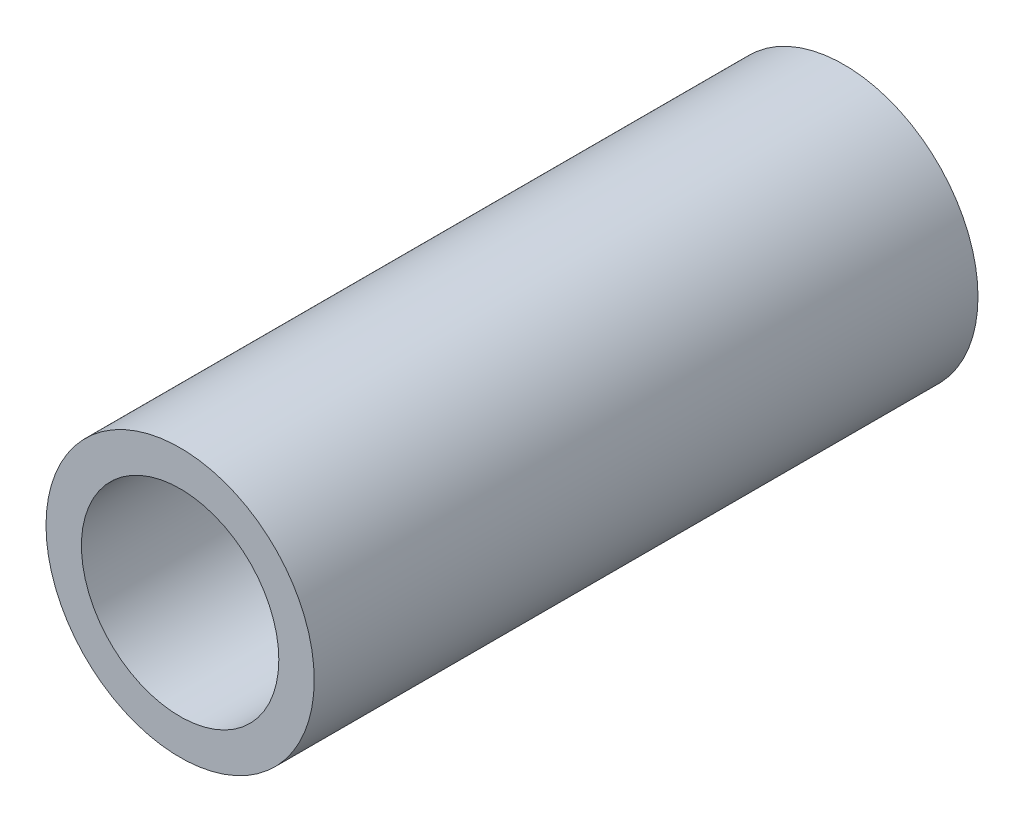
ISO-10303-21;
HEADER;
FILE_DESCRIPTION(('STEP AP214'),'2;1');
FILE_NAME('part.step','',(''),(''),'','','');
FILE_SCHEMA(('AUTOMOTIVE_DESIGN { 1 0 10303 214 1 1 1 1 }'));
ENDSEC;
DATA;
#1=APPLICATION_CONTEXT('core data for automotive mechanical design processes');
#2=APPLICATION_PROTOCOL_DEFINITION('international standard','automotive_design',2000,#1);
#3=PRODUCT_CONTEXT('',#1,'mechanical');
#4=PRODUCT('Part','Part','',(#3));
#5=PRODUCT_RELATED_PRODUCT_CATEGORY('part','',(#4));
#6=PRODUCT_DEFINITION_FORMATION('','',#4);
#7=PRODUCT_DEFINITION_CONTEXT('part definition',#1,'design');
#8=PRODUCT_DEFINITION('design','',#6,#7);
#9=PRODUCT_DEFINITION_SHAPE('','',#8);
#10=(LENGTH_UNIT() NAMED_UNIT(*) SI_UNIT(.MILLI.,.METRE.));
#11=(NAMED_UNIT(*) PLANE_ANGLE_UNIT() SI_UNIT($,.RADIAN.));
#12=(NAMED_UNIT(*) SI_UNIT($,.STERADIAN.) SOLID_ANGLE_UNIT());
#13=UNCERTAINTY_MEASURE_WITH_UNIT(LENGTH_MEASURE(1.E-05),#10,'distance_accuracy_value','');
#14=(GEOMETRIC_REPRESENTATION_CONTEXT(3) GLOBAL_UNCERTAINTY_ASSIGNED_CONTEXT((#13)) GLOBAL_UNIT_ASSIGNED_CONTEXT((#10,
#11,#12)) REPRESENTATION_CONTEXT('',''));
#15=CARTESIAN_POINT('',(0.,0.,0.));
#16=DIRECTION('',(0.,0.,1.));
#17=DIRECTION('',(1.,0.,0.));
#18=AXIS2_PLACEMENT_3D('',#15,#16,#17);
#19=CARTESIAN_POINT('',(0.,0.,43.2154482118713));
#20=DIRECTION('',(0.,0.,-1.));
#21=DIRECTION('',(-1.,0.,0.));
#22=AXIS2_PLACEMENT_3D('',#19,#20,#21);
#23=CYLINDRICAL_SURFACE('',#22,5.55625);
#24=CARTESIAN_POINT('',(0.,0.,0.));
#25=DIRECTION('',(0.,0.,1.));
#26=DIRECTION('',(1.,0.,0.));
#27=AXIS2_PLACEMENT_3D('',#24,#25,#26);
#28=CIRCLE('',#27,5.55625);
#29=CARTESIAN_POINT('',(5.55625,0.,0.));
#30=VERTEX_POINT('',#29);
#31=EDGE_CURVE('E42',#30,#30,#28,.T.);
#32=ORIENTED_EDGE('',*,*,#31,.T.);
#33=EDGE_LOOP('',(#32));
#34=FACE_BOUND('',#33,.T.);
#35=CARTESIAN_POINT('',(0.,0.,27.5000000000002));
#36=DIRECTION('',(0.,0.,1.));
#37=DIRECTION('',(1.,0.,0.));
#38=AXIS2_PLACEMENT_3D('',#35,#36,#37);
#39=CIRCLE('',#38,5.55625);
#40=CARTESIAN_POINT('',(5.55625,0.,27.5000000000002));
#41=VERTEX_POINT('',#40);
#42=EDGE_CURVE('E10',#41,#41,#39,.T.);
#43=ORIENTED_EDGE('',*,*,#42,.F.);
#44=EDGE_LOOP('',(#43));
#45=FACE_BOUND('',#44,.T.);
#46=ADVANCED_FACE('F31',(#34,#45),#23,.T.);
#47=CARTESIAN_POINT('',(0.,0.,0.));
#48=DIRECTION('',(0.,0.,1.));
#49=DIRECTION('',(1.,0.,0.));
#50=AXIS2_PLACEMENT_3D('',#47,#48,#49);
#51=PLANE('',#50);
#52=ORIENTED_EDGE('',*,*,#31,.F.);
#53=EDGE_LOOP('',(#52));
#54=FACE_BOUND('',#53,.T.);
#55=CARTESIAN_POINT('',(0.,0.,0.));
#56=DIRECTION('',(0.,0.,1.));
#57=DIRECTION('',(1.,0.,0.));
#58=AXIS2_PLACEMENT_3D('',#55,#56,#57);
#59=CIRCLE('',#58,4.0894);
#60=CARTESIAN_POINT('',(4.0894,0.,0.));
#61=VERTEX_POINT('',#60);
#62=EDGE_CURVE('E44',#61,#61,#59,.T.);
#63=ORIENTED_EDGE('',*,*,#62,.T.);
#64=EDGE_LOOP('',(#63));
#65=FACE_BOUND('',#64,.T.);
#66=ADVANCED_FACE('F51',(#54,#65),#51,.F.);
#67=CARTESIAN_POINT('',(0.,0.,43.2154482118713));
#68=DIRECTION('',(0.,0.,-1.));
#69=DIRECTION('',(-1.,0.,0.));
#70=AXIS2_PLACEMENT_3D('',#67,#68,#69);
#71=CYLINDRICAL_SURFACE('',#70,4.0894);
#72=ORIENTED_EDGE('',*,*,#62,.F.);
#73=EDGE_LOOP('',(#72));
#74=FACE_BOUND('',#73,.T.);
#75=CARTESIAN_POINT('',(0.,0.,27.5000000000002));
#76=DIRECTION('',(0.,0.,1.));
#77=DIRECTION('',(1.,0.,0.));
#78=AXIS2_PLACEMENT_3D('',#75,#76,#77);
#79=CIRCLE('',#78,4.0894);
#80=CARTESIAN_POINT('',(4.0894,0.,27.5000000000002));
#81=VERTEX_POINT('',#80);
#82=EDGE_CURVE('E34',#81,#81,#79,.T.);
#83=ORIENTED_EDGE('',*,*,#82,.T.);
#84=EDGE_LOOP('',(#83));
#85=FACE_BOUND('',#84,.T.);
#86=ADVANCED_FACE('F54',(#74,#85),#71,.F.);
#87=CARTESIAN_POINT('',(5.87999999999999,4.25270103555652E-09,27.5000000000002));
#88=DIRECTION('',(0.,0.,1.));
#89=DIRECTION('',(1.,7.23313281956604E-10,0.));
#90=AXIS2_PLACEMENT_3D('',#87,#88,#89);
#91=PLANE('',#90);
#92=ORIENTED_EDGE('',*,*,#82,.F.);
#93=EDGE_LOOP('',(#92));
#94=FACE_BOUND('',#93,.T.);
#95=ORIENTED_EDGE('',*,*,#42,.T.);
#96=EDGE_LOOP('',(#95));
#97=FACE_BOUND('',#96,.T.);
#98=ADVANCED_FACE('F59',(#94,#97),#91,.T.);
#99=CLOSED_SHELL('',(#46,#66,#86,#98));
#100=MANIFOLD_SOLID_BREP('B2',#99);
#101=ADVANCED_BREP_SHAPE_REPRESENTATION('',(#18,#100),#14);
#102=SHAPE_DEFINITION_REPRESENTATION(#9,#101);
ENDSEC;
END-ISO-10303-21;
